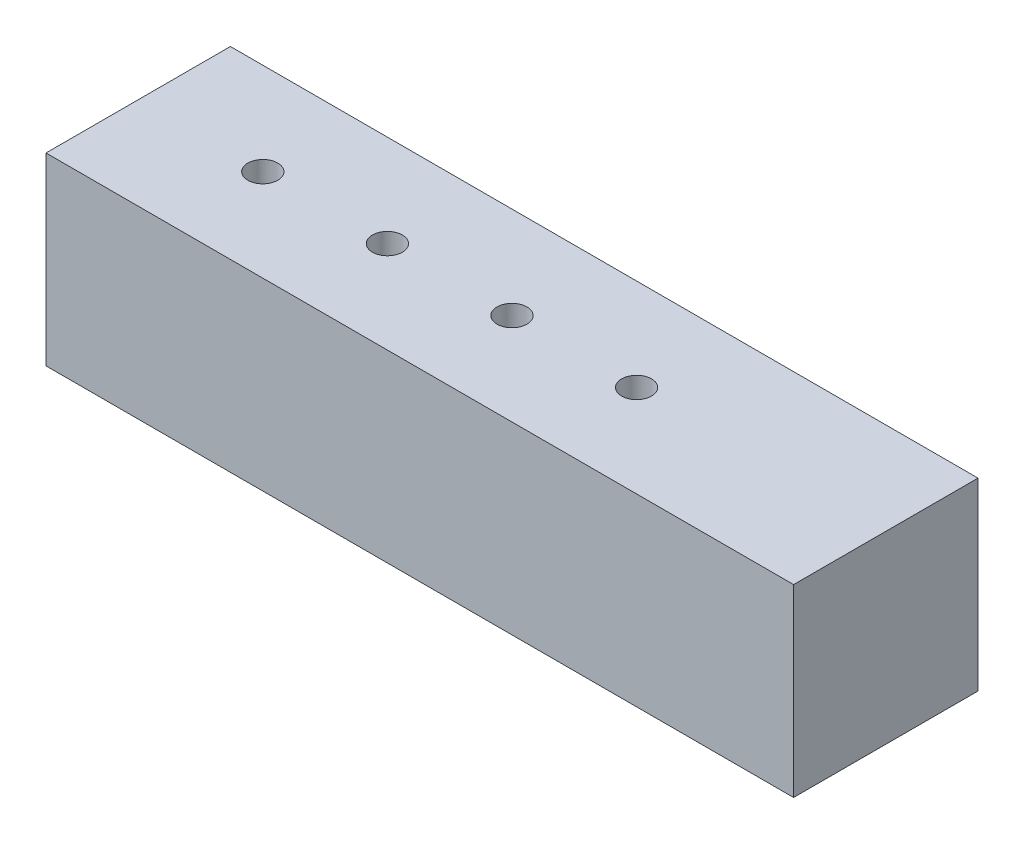
ISO-10303-21;
HEADER;
FILE_DESCRIPTION(('STEP AP214'),'2;1');
FILE_NAME('part.step','',(''),(''),'','','');
FILE_SCHEMA(('AUTOMOTIVE_DESIGN { 1 0 10303 214 1 1 1 1 }'));
ENDSEC;
DATA;
#1=APPLICATION_CONTEXT('core data for automotive mechanical design processes');
#2=APPLICATION_PROTOCOL_DEFINITION('international standard','automotive_design',2000,#1);
#3=PRODUCT_CONTEXT('',#1,'mechanical');
#4=PRODUCT('Part','Part','',(#3));
#5=PRODUCT_RELATED_PRODUCT_CATEGORY('part','',(#4));
#6=PRODUCT_DEFINITION_FORMATION('','',#4);
#7=PRODUCT_DEFINITION_CONTEXT('part definition',#1,'design');
#8=PRODUCT_DEFINITION('design','',#6,#7);
#9=PRODUCT_DEFINITION_SHAPE('','',#8);
#10=(LENGTH_UNIT() NAMED_UNIT(*) SI_UNIT(.MILLI.,.METRE.));
#11=(NAMED_UNIT(*) PLANE_ANGLE_UNIT() SI_UNIT($,.RADIAN.));
#12=(NAMED_UNIT(*) SI_UNIT($,.STERADIAN.) SOLID_ANGLE_UNIT());
#13=UNCERTAINTY_MEASURE_WITH_UNIT(LENGTH_MEASURE(1.E-05),#10,'distance_accuracy_value','');
#14=(GEOMETRIC_REPRESENTATION_CONTEXT(3) GLOBAL_UNCERTAINTY_ASSIGNED_CONTEXT((#13)) GLOBAL_UNIT_ASSIGNED_CONTEXT((#10,
#11,#12)) REPRESENTATION_CONTEXT('',''));
#15=CARTESIAN_POINT('',(0.,0.,0.));
#16=DIRECTION('',(0.,0.,1.));
#17=DIRECTION('',(1.,0.,0.));
#18=AXIS2_PLACEMENT_3D('',#15,#16,#17);
#19=CARTESIAN_POINT('',(75.,37.,-18.5));
#20=DIRECTION('',(-1.,0.,0.));
#21=DIRECTION('',(0.,0.,1.));
#22=AXIS2_PLACEMENT_3D('',#19,#20,#21);
#23=PLANE('',#22);
#24=DIRECTION('',(0.,0.,-1.));
#25=VECTOR('',#24,1.);
#26=CARTESIAN_POINT('',(75.,0.,-18.5));
#27=LINE('',#26,#25);
#28=CARTESIAN_POINT('',(75.,0.,18.5));
#29=VERTEX_POINT('',#28);
#30=CARTESIAN_POINT('',(75.,0.,-18.5));
#31=VERTEX_POINT('',#30);
#32=EDGE_CURVE('E100',#29,#31,#27,.T.);
#33=ORIENTED_EDGE('',*,*,#32,.T.);
#34=DIRECTION('',(0.,-1.,0.));
#35=VECTOR('',#34,1.);
#36=CARTESIAN_POINT('',(75.,37.,-18.5));
#37=LINE('',#36,#35);
#38=CARTESIAN_POINT('',(75.,37.,-18.5));
#39=VERTEX_POINT('',#38);
#40=EDGE_CURVE('E11',#39,#31,#37,.T.);
#41=ORIENTED_EDGE('',*,*,#40,.F.);
#42=DIRECTION('',(0.,0.,-1.));
#43=VECTOR('',#42,1.);
#44=CARTESIAN_POINT('',(75.,37.,-18.5));
#45=LINE('',#44,#43);
#46=CARTESIAN_POINT('',(75.,37.,18.5));
#47=VERTEX_POINT('',#46);
#48=EDGE_CURVE('E88',#47,#39,#45,.T.);
#49=ORIENTED_EDGE('',*,*,#48,.F.);
#50=DIRECTION('',(0.,-1.,0.));
#51=VECTOR('',#50,1.);
#52=CARTESIAN_POINT('',(75.,37.,18.5));
#53=LINE('',#52,#51);
#54=EDGE_CURVE('E96',#47,#29,#53,.T.);
#55=ORIENTED_EDGE('',*,*,#54,.T.);
#56=EDGE_LOOP('',(#33,#41,#49,#55));
#57=FACE_BOUND('',#56,.T.);
#58=ADVANCED_FACE('F37',(#57),#23,.F.);
#59=CARTESIAN_POINT('',(-75.,37.,-18.5));
#60=DIRECTION('',(0.,0.,1.));
#61=DIRECTION('',(1.,0.,0.));
#62=AXIS2_PLACEMENT_3D('',#59,#60,#61);
#63=PLANE('',#62);
#64=DIRECTION('',(-1.,0.,0.));
#65=VECTOR('',#64,1.);
#66=CARTESIAN_POINT('',(-75.,0.,-18.5));
#67=LINE('',#66,#65);
#68=CARTESIAN_POINT('',(-75.,0.,-18.5));
#69=VERTEX_POINT('',#68);
#70=EDGE_CURVE('E92',#31,#69,#67,.T.);
#71=ORIENTED_EDGE('',*,*,#70,.T.);
#72=DIRECTION('',(0.,-1.,0.));
#73=VECTOR('',#72,1.);
#74=CARTESIAN_POINT('',(-75.,37.,-18.5));
#75=LINE('',#74,#73);
#76=CARTESIAN_POINT('',(-75.,37.,-18.5));
#77=VERTEX_POINT('',#76);
#78=EDGE_CURVE('E45',#77,#69,#75,.T.);
#79=ORIENTED_EDGE('',*,*,#78,.F.);
#80=DIRECTION('',(-1.,0.,0.));
#81=VECTOR('',#80,1.);
#82=CARTESIAN_POINT('',(-75.,37.,-18.5));
#83=LINE('',#82,#81);
#84=EDGE_CURVE('E83',#39,#77,#83,.T.);
#85=ORIENTED_EDGE('',*,*,#84,.F.);
#86=ORIENTED_EDGE('',*,*,#40,.T.);
#87=EDGE_LOOP('',(#71,#79,#85,#86));
#88=FACE_BOUND('',#87,.T.);
#89=ADVANCED_FACE('F91',(#88),#63,.F.);
#90=CARTESIAN_POINT('',(-75.,37.,-18.5));
#91=DIRECTION('',(1.,0.,0.));
#92=DIRECTION('',(0.,0.,-1.));
#93=AXIS2_PLACEMENT_3D('',#90,#91,#92);
#94=PLANE('',#93);
#95=DIRECTION('',(0.,0.,1.));
#96=VECTOR('',#95,1.);
#97=CARTESIAN_POINT('',(-75.,0.,-18.5));
#98=LINE('',#97,#96);
#99=CARTESIAN_POINT('',(-75.,0.,18.5));
#100=VERTEX_POINT('',#99);
#101=EDGE_CURVE('E70',#69,#100,#98,.T.);
#102=ORIENTED_EDGE('',*,*,#101,.T.);
#103=DIRECTION('',(0.,-1.,0.));
#104=VECTOR('',#103,1.);
#105=CARTESIAN_POINT('',(-75.,37.,18.5));
#106=LINE('',#105,#104);
#107=CARTESIAN_POINT('',(-75.,37.,18.5));
#108=VERTEX_POINT('',#107);
#109=EDGE_CURVE('E93',#108,#100,#106,.T.);
#110=ORIENTED_EDGE('',*,*,#109,.F.);
#111=DIRECTION('',(0.,0.,1.));
#112=VECTOR('',#111,1.);
#113=CARTESIAN_POINT('',(-75.,37.,-18.5));
#114=LINE('',#113,#112);
#115=EDGE_CURVE('E86',#77,#108,#114,.T.);
#116=ORIENTED_EDGE('',*,*,#115,.F.);
#117=ORIENTED_EDGE('',*,*,#78,.T.);
#118=EDGE_LOOP('',(#102,#110,#116,#117));
#119=FACE_BOUND('',#118,.T.);
#120=ADVANCED_FACE('F94',(#119),#94,.F.);
#121=CARTESIAN_POINT('',(-75.,37.,18.5));
#122=DIRECTION('',(0.,0.,-1.));
#123=DIRECTION('',(-1.,0.,0.));
#124=AXIS2_PLACEMENT_3D('',#121,#122,#123);
#125=PLANE('',#124);
#126=DIRECTION('',(1.,0.,0.));
#127=VECTOR('',#126,1.);
#128=CARTESIAN_POINT('',(-75.,0.,18.5));
#129=LINE('',#128,#127);
#130=EDGE_CURVE('E76',#100,#29,#129,.T.);
#131=ORIENTED_EDGE('',*,*,#130,.T.);
#132=ORIENTED_EDGE('',*,*,#54,.F.);
#133=DIRECTION('',(1.,0.,0.));
#134=VECTOR('',#133,1.);
#135=CARTESIAN_POINT('',(-75.,37.,18.5));
#136=LINE('',#135,#134);
#137=EDGE_CURVE('E53',#108,#47,#136,.T.);
#138=ORIENTED_EDGE('',*,*,#137,.F.);
#139=ORIENTED_EDGE('',*,*,#109,.T.);
#140=EDGE_LOOP('',(#131,#132,#138,#139));
#141=FACE_BOUND('',#140,.T.);
#142=ADVANCED_FACE('F108',(#141),#125,.F.);
#143=CARTESIAN_POINT('',(0.,37.,0.));
#144=DIRECTION('',(0.,1.,0.));
#145=DIRECTION('',(0.,0.,1.));
#146=AXIS2_PLACEMENT_3D('',#143,#144,#145);
#147=PLANE('',#146);
#148=CARTESIAN_POINT('',(-50.,37.,0.));
#149=DIRECTION('',(0.,1.,0.));
#150=DIRECTION('',(0.,0.,1.));
#151=AXIS2_PLACEMENT_3D('',#148,#149,#150);
#152=CIRCLE('',#151,3.);
#153=CARTESIAN_POINT('',(-50.,37.,3.));
#154=VERTEX_POINT('',#153);
#155=EDGE_CURVE('E132',#154,#154,#152,.T.);
#156=ORIENTED_EDGE('',*,*,#155,.F.);
#157=EDGE_LOOP('',(#156));
#158=FACE_BOUND('',#157,.T.);
#159=CARTESIAN_POINT('',(-25.,37.,0.));
#160=DIRECTION('',(0.,1.,0.));
#161=DIRECTION('',(0.,0.,1.));
#162=AXIS2_PLACEMENT_3D('',#159,#160,#161);
#163=CIRCLE('',#162,3.);
#164=CARTESIAN_POINT('',(-25.,37.,3.));
#165=VERTEX_POINT('',#164);
#166=EDGE_CURVE('E129',#165,#165,#163,.T.);
#167=ORIENTED_EDGE('',*,*,#166,.F.);
#168=EDGE_LOOP('',(#167));
#169=FACE_BOUND('',#168,.T.);
#170=CARTESIAN_POINT('',(0.,37.,0.));
#171=DIRECTION('',(0.,1.,0.));
#172=DIRECTION('',(0.,0.,1.));
#173=AXIS2_PLACEMENT_3D('',#170,#171,#172);
#174=CIRCLE('',#173,3.);
#175=CARTESIAN_POINT('',(0.,37.,3.));
#176=VERTEX_POINT('',#175);
#177=EDGE_CURVE('E123',#176,#176,#174,.T.);
#178=ORIENTED_EDGE('',*,*,#177,.F.);
#179=EDGE_LOOP('',(#178));
#180=FACE_BOUND('',#179,.T.);
#181=CARTESIAN_POINT('',(25.,37.,0.));
#182=DIRECTION('',(0.,1.,0.));
#183=DIRECTION('',(0.,0.,1.));
#184=AXIS2_PLACEMENT_3D('',#181,#182,#183);
#185=CIRCLE('',#184,3.);
#186=CARTESIAN_POINT('',(25.,37.,3.));
#187=VERTEX_POINT('',#186);
#188=EDGE_CURVE('E117',#187,#187,#185,.T.);
#189=ORIENTED_EDGE('',*,*,#188,.F.);
#190=EDGE_LOOP('',(#189));
#191=FACE_BOUND('',#190,.T.);
#192=ORIENTED_EDGE('',*,*,#48,.T.);
#193=ORIENTED_EDGE('',*,*,#84,.T.);
#194=ORIENTED_EDGE('',*,*,#115,.T.);
#195=ORIENTED_EDGE('',*,*,#137,.T.);
#196=EDGE_LOOP('',(#192,#193,#194,#195));
#197=FACE_BOUND('',#196,.T.);
#198=ADVANCED_FACE('F84',(#158,#169,#180,#191,#197),#147,.T.);
#199=CARTESIAN_POINT('',(0.,0.,0.));
#200=DIRECTION('',(0.,1.,0.));
#201=DIRECTION('',(0.,0.,1.));
#202=AXIS2_PLACEMENT_3D('',#199,#200,#201);
#203=PLANE('',#202);
#204=CARTESIAN_POINT('',(-50.,0.,0.));
#205=DIRECTION('',(0.,1.,0.));
#206=DIRECTION('',(0.,0.,1.));
#207=AXIS2_PLACEMENT_3D('',#204,#205,#206);
#208=CIRCLE('',#207,3.);
#209=CARTESIAN_POINT('',(-50.,0.,3.));
#210=VERTEX_POINT('',#209);
#211=EDGE_CURVE('E103',#210,#210,#208,.T.);
#212=ORIENTED_EDGE('',*,*,#211,.T.);
#213=EDGE_LOOP('',(#212));
#214=FACE_BOUND('',#213,.T.);
#215=CARTESIAN_POINT('',(-25.,0.,0.));
#216=DIRECTION('',(0.,1.,0.));
#217=DIRECTION('',(0.,0.,1.));
#218=AXIS2_PLACEMENT_3D('',#215,#216,#217);
#219=CIRCLE('',#218,3.);
#220=CARTESIAN_POINT('',(-25.,0.,3.));
#221=VERTEX_POINT('',#220);
#222=EDGE_CURVE('E126',#221,#221,#219,.T.);
#223=ORIENTED_EDGE('',*,*,#222,.T.);
#224=EDGE_LOOP('',(#223));
#225=FACE_BOUND('',#224,.T.);
#226=CARTESIAN_POINT('',(0.,0.,0.));
#227=DIRECTION('',(0.,1.,0.));
#228=DIRECTION('',(0.,0.,1.));
#229=AXIS2_PLACEMENT_3D('',#226,#227,#228);
#230=CIRCLE('',#229,3.);
#231=CARTESIAN_POINT('',(0.,0.,3.));
#232=VERTEX_POINT('',#231);
#233=EDGE_CURVE('E120',#232,#232,#230,.T.);
#234=ORIENTED_EDGE('',*,*,#233,.T.);
#235=EDGE_LOOP('',(#234));
#236=FACE_BOUND('',#235,.T.);
#237=CARTESIAN_POINT('',(25.,0.,0.));
#238=DIRECTION('',(0.,1.,0.));
#239=DIRECTION('',(0.,0.,1.));
#240=AXIS2_PLACEMENT_3D('',#237,#238,#239);
#241=CIRCLE('',#240,3.);
#242=CARTESIAN_POINT('',(25.,0.,3.));
#243=VERTEX_POINT('',#242);
#244=EDGE_CURVE('E114',#243,#243,#241,.T.);
#245=ORIENTED_EDGE('',*,*,#244,.T.);
#246=EDGE_LOOP('',(#245));
#247=FACE_BOUND('',#246,.T.);
#248=ORIENTED_EDGE('',*,*,#32,.F.);
#249=ORIENTED_EDGE('',*,*,#130,.F.);
#250=ORIENTED_EDGE('',*,*,#101,.F.);
#251=ORIENTED_EDGE('',*,*,#70,.F.);
#252=EDGE_LOOP('',(#248,#249,#250,#251));
#253=FACE_BOUND('',#252,.T.);
#254=ADVANCED_FACE('F111',(#214,#225,#236,#247,#253),#203,.F.);
#255=CARTESIAN_POINT('',(25.,0.,0.));
#256=DIRECTION('',(0.,1.,0.));
#257=DIRECTION('',(0.,0.,1.));
#258=AXIS2_PLACEMENT_3D('',#255,#256,#257);
#259=CYLINDRICAL_SURFACE('',#258,3.);
#260=ORIENTED_EDGE('',*,*,#244,.F.);
#261=EDGE_LOOP('',(#260));
#262=FACE_BOUND('',#261,.T.);
#263=ORIENTED_EDGE('',*,*,#188,.T.);
#264=EDGE_LOOP('',(#263));
#265=FACE_BOUND('',#264,.T.);
#266=ADVANCED_FACE('F156',(#262,#265),#259,.F.);
#267=CARTESIAN_POINT('',(0.,0.,0.));
#268=DIRECTION('',(0.,1.,0.));
#269=DIRECTION('',(0.,0.,1.));
#270=AXIS2_PLACEMENT_3D('',#267,#268,#269);
#271=CYLINDRICAL_SURFACE('',#270,3.);
#272=ORIENTED_EDGE('',*,*,#233,.F.);
#273=EDGE_LOOP('',(#272));
#274=FACE_BOUND('',#273,.T.);
#275=ORIENTED_EDGE('',*,*,#177,.T.);
#276=EDGE_LOOP('',(#275));
#277=FACE_BOUND('',#276,.T.);
#278=ADVANCED_FACE('F158',(#274,#277),#271,.F.);
#279=CARTESIAN_POINT('',(-25.,0.,0.));
#280=DIRECTION('',(0.,1.,0.));
#281=DIRECTION('',(0.,0.,1.));
#282=AXIS2_PLACEMENT_3D('',#279,#280,#281);
#283=CYLINDRICAL_SURFACE('',#282,3.);
#284=ORIENTED_EDGE('',*,*,#222,.F.);
#285=EDGE_LOOP('',(#284));
#286=FACE_BOUND('',#285,.T.);
#287=ORIENTED_EDGE('',*,*,#166,.T.);
#288=EDGE_LOOP('',(#287));
#289=FACE_BOUND('',#288,.T.);
#290=ADVANCED_FACE('F143',(#286,#289),#283,.F.);
#291=CARTESIAN_POINT('',(-50.,0.,0.));
#292=DIRECTION('',(0.,1.,0.));
#293=DIRECTION('',(0.,0.,1.));
#294=AXIS2_PLACEMENT_3D('',#291,#292,#293);
#295=CYLINDRICAL_SURFACE('',#294,3.);
#296=ORIENTED_EDGE('',*,*,#211,.F.);
#297=EDGE_LOOP('',(#296));
#298=FACE_BOUND('',#297,.T.);
#299=ORIENTED_EDGE('',*,*,#155,.T.);
#300=EDGE_LOOP('',(#299));
#301=FACE_BOUND('',#300,.T.);
#302=ADVANCED_FACE('F140',(#298,#301),#295,.F.);
#303=CLOSED_SHELL('',(#58,#89,#120,#142,#198,#254,#266,#278,#290,#302));
#304=MANIFOLD_SOLID_BREP('B2',#303);
#305=ADVANCED_BREP_SHAPE_REPRESENTATION('',(#18,#304),#14);
#306=SHAPE_DEFINITION_REPRESENTATION(#9,#305);
ENDSEC;
END-ISO-10303-21;
